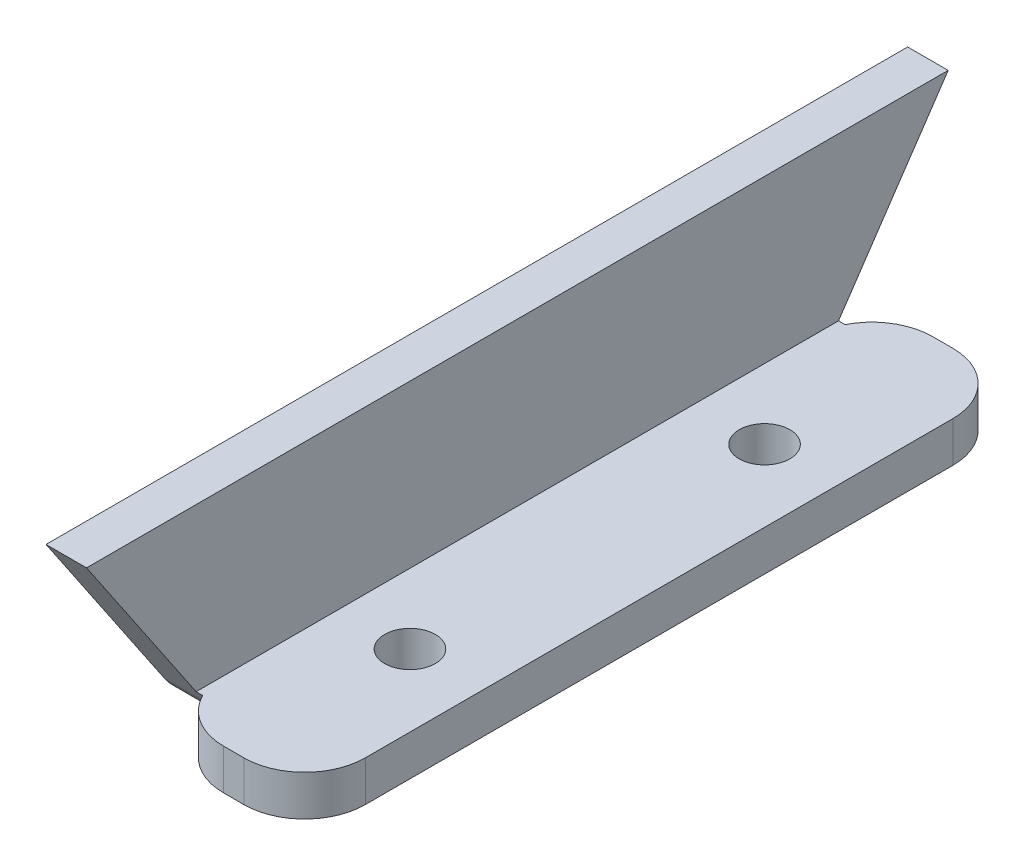
ISO-10303-21;
HEADER;
FILE_DESCRIPTION(('STEP AP214'),'2;1');
FILE_NAME('part.step','',(''),(''),'','','');
FILE_SCHEMA(('AUTOMOTIVE_DESIGN { 1 0 10303 214 1 1 1 1 }'));
ENDSEC;
DATA;
#1=APPLICATION_CONTEXT('core data for automotive mechanical design processes');
#2=APPLICATION_PROTOCOL_DEFINITION('international standard','automotive_design',2000,#1);
#3=PRODUCT_CONTEXT('',#1,'mechanical');
#4=PRODUCT('Part','Part','',(#3));
#5=PRODUCT_RELATED_PRODUCT_CATEGORY('part','',(#4));
#6=PRODUCT_DEFINITION_FORMATION('','',#4);
#7=PRODUCT_DEFINITION_CONTEXT('part definition',#1,'design');
#8=PRODUCT_DEFINITION('design','',#6,#7);
#9=PRODUCT_DEFINITION_SHAPE('','',#8);
#10=(LENGTH_UNIT() NAMED_UNIT(*) SI_UNIT(.MILLI.,.METRE.));
#11=(NAMED_UNIT(*) PLANE_ANGLE_UNIT() SI_UNIT($,.RADIAN.));
#12=(NAMED_UNIT(*) SI_UNIT($,.STERADIAN.) SOLID_ANGLE_UNIT());
#13=UNCERTAINTY_MEASURE_WITH_UNIT(LENGTH_MEASURE(1.E-05),#10,'distance_accuracy_value','');
#14=(GEOMETRIC_REPRESENTATION_CONTEXT(3) GLOBAL_UNCERTAINTY_ASSIGNED_CONTEXT((#13)) GLOBAL_UNIT_ASSIGNED_CONTEXT((#10,
#11,#12)) REPRESENTATION_CONTEXT('',''));
#15=CARTESIAN_POINT('',(0.,0.,0.));
#16=DIRECTION('',(0.,0.,1.));
#17=DIRECTION('',(1.,0.,0.));
#18=AXIS2_PLACEMENT_3D('',#15,#16,#17);
#19=CARTESIAN_POINT('',(0.,-20.7753854246319,0.));
#20=DIRECTION('',(0.,-1.,0.));
#21=DIRECTION('',(0.,0.,-1.));
#22=AXIS2_PLACEMENT_3D('',#19,#20,#21);
#23=PLANE('',#22);
#24=CARTESIAN_POINT('',(3.45011650694153,-20.7753854246319,-8.75));
#25=DIRECTION('',(0.,1.,0.));
#26=DIRECTION('',(0.,0.,1.));
#27=AXIS2_PLACEMENT_3D('',#24,#25,#26);
#28=CIRCLE('',#27,1.25);
#29=CARTESIAN_POINT('',(3.45011650694153,-20.7753854246319,-7.5));
#30=VERTEX_POINT('',#29);
#31=EDGE_CURVE('E380',#30,#30,#28,.T.);
#32=ORIENTED_EDGE('',*,*,#31,.F.);
#33=EDGE_LOOP('',(#32));
#34=FACE_BOUND('',#33,.T.);
#35=DIRECTION('',(0.,0.,-1.));
#36=VECTOR('',#35,1.);
#37=CARTESIAN_POINT('',(0.,-20.7753854246319,14.5));
#38=LINE('',#37,#36);
#39=CARTESIAN_POINT('',(0.,-20.7753854246319,15.8526548687186));
#40=VERTEX_POINT('',#39);
#41=CARTESIAN_POINT('',(0.,-20.7753854246319,-15.8526548687186));
#42=VERTEX_POINT('',#41);
#43=EDGE_CURVE('E197',#40,#42,#38,.T.);
#44=ORIENTED_EDGE('',*,*,#43,.F.);
#45=DIRECTION('',(1.,0.,0.));
#46=VECTOR('',#45,1.);
#47=CARTESIAN_POINT('',(-2.,-20.7753854246319,15.8526548687186));
#48=LINE('',#47,#46);
#49=CARTESIAN_POINT('',(0.322253782351296,-20.7753854246319,15.8526548687186));
#50=VERTEX_POINT('',#49);
#51=EDGE_CURVE('E71',#40,#50,#48,.T.);
#52=ORIENTED_EDGE('',*,*,#51,.T.);
#53=CARTESIAN_POINT('',(3.,-20.7753854246319,14.5));
#54=DIRECTION('',(0.,-1.,0.));
#55=DIRECTION('',(0.,0.,-1.));
#56=AXIS2_PLACEMENT_3D('',#53,#54,#55);
#57=CIRCLE('',#56,3.);
#58=CARTESIAN_POINT('',(3.,-20.7753854246319,17.5));
#59=VERTEX_POINT('',#58);
#60=EDGE_CURVE('E220',#50,#59,#57,.F.);
#61=ORIENTED_EDGE('',*,*,#60,.T.);
#62=DIRECTION('',(-1.,0.,0.));
#63=VECTOR('',#62,1.);
#64=CARTESIAN_POINT('',(-2.,-20.7753854246319,17.5));
#65=LINE('',#64,#63);
#66=CARTESIAN_POINT('',(4.00000000000001,-20.7753854246319,17.5));
#67=VERTEX_POINT('',#66);
#68=EDGE_CURVE('E346',#67,#59,#65,.T.);
#69=ORIENTED_EDGE('',*,*,#68,.F.);
#70=CARTESIAN_POINT('',(4.00000000000001,-20.7753854246319,14.5));
#71=DIRECTION('',(0.,-1.,0.));
#72=DIRECTION('',(0.,0.,-1.));
#73=AXIS2_PLACEMENT_3D('',#70,#71,#72);
#74=CIRCLE('',#73,3.);
#75=CARTESIAN_POINT('',(7.00000000000001,-20.7753854246319,14.5));
#76=VERTEX_POINT('',#75);
#77=EDGE_CURVE('E211',#67,#76,#74,.F.);
#78=ORIENTED_EDGE('',*,*,#77,.T.);
#79=DIRECTION('',(0.,0.,1.));
#80=VECTOR('',#79,1.);
#81=CARTESIAN_POINT('',(7.00000000000001,-20.7753854246319,14.5));
#82=LINE('',#81,#80);
#83=CARTESIAN_POINT('',(7.00000000000001,-20.7753854246319,-14.5));
#84=VERTEX_POINT('',#83);
#85=EDGE_CURVE('E343',#84,#76,#82,.T.);
#86=ORIENTED_EDGE('',*,*,#85,.F.);
#87=CARTESIAN_POINT('',(4.00000000000001,-20.7753854246319,-14.5));
#88=DIRECTION('',(0.,-1.,0.));
#89=DIRECTION('',(0.,0.,-1.));
#90=AXIS2_PLACEMENT_3D('',#87,#88,#89);
#91=CIRCLE('',#90,3.);
#92=CARTESIAN_POINT('',(4.00000000000001,-20.7753854246319,-17.5));
#93=VERTEX_POINT('',#92);
#94=EDGE_CURVE('E213',#84,#93,#91,.F.);
#95=ORIENTED_EDGE('',*,*,#94,.T.);
#96=DIRECTION('',(1.,0.,0.));
#97=VECTOR('',#96,1.);
#98=CARTESIAN_POINT('',(-2.,-20.7753854246319,-17.5));
#99=LINE('',#98,#97);
#100=CARTESIAN_POINT('',(3.,-20.7753854246319,-17.5));
#101=VERTEX_POINT('',#100);
#102=EDGE_CURVE('E318',#101,#93,#99,.T.);
#103=ORIENTED_EDGE('',*,*,#102,.F.);
#104=CARTESIAN_POINT('',(3.,-20.7753854246319,-14.5));
#105=DIRECTION('',(0.,-1.,0.));
#106=DIRECTION('',(0.,0.,-1.));
#107=AXIS2_PLACEMENT_3D('',#104,#105,#106);
#108=CIRCLE('',#107,3.);
#109=CARTESIAN_POINT('',(0.322253782351291,-20.7753854246319,-15.8526548687186));
#110=VERTEX_POINT('',#109);
#111=EDGE_CURVE('E215',#101,#110,#108,.F.);
#112=ORIENTED_EDGE('',*,*,#111,.T.);
#113=DIRECTION('',(-1.,0.,0.));
#114=VECTOR('',#113,1.);
#115=CARTESIAN_POINT('',(-2.,-20.7753854246319,-15.8526548687186));
#116=LINE('',#115,#114);
#117=EDGE_CURVE('E218',#110,#42,#116,.T.);
#118=ORIENTED_EDGE('',*,*,#117,.T.);
#119=EDGE_LOOP('',(#44,#52,#61,#69,#78,#86,#95,#103,#112,#118));
#120=FACE_BOUND('',#119,.T.);
#121=CARTESIAN_POINT('',(3.45011650694153,-20.7753854246319,8.75));
#122=DIRECTION('',(0.,1.,0.));
#123=DIRECTION('',(0.,0.,1.));
#124=AXIS2_PLACEMENT_3D('',#121,#122,#123);
#125=CIRCLE('',#124,1.25);
#126=CARTESIAN_POINT('',(3.45011650694153,-20.7753854246319,10.));
#127=VERTEX_POINT('',#126);
#128=EDGE_CURVE('E386',#127,#127,#125,.T.);
#129=ORIENTED_EDGE('',*,*,#128,.F.);
#130=EDGE_LOOP('',(#129));
#131=FACE_BOUND('',#130,.T.);
#132=ADVANCED_FACE('F43',(#34,#120,#131),#23,.F.);
#133=CARTESIAN_POINT('',(0.,0.,0.));
#134=DIRECTION('',(1.,0.,0.));
#135=DIRECTION('',(0.,0.,-1.));
#136=AXIS2_PLACEMENT_3D('',#133,#134,#135);
#137=PLANE('',#136);
#138=DIRECTION('',(0.,-0.828338441447025,-0.560228012885034));
#139=VECTOR('',#138,1.);
#140=CARTESIAN_POINT('',(0.,-22.7753854246319,14.5));
#141=LINE('',#140,#139);
#142=CARTESIAN_POINT('',(0.,-12.7753854246319,21.2632743435928));
#143=VERTEX_POINT('',#142);
#144=EDGE_CURVE('E313',#143,#40,#141,.T.);
#145=ORIENTED_EDGE('',*,*,#144,.T.);
#146=ORIENTED_EDGE('',*,*,#43,.T.);
#147=DIRECTION('',(0.,0.828338441447025,-0.560228012885034));
#148=VECTOR('',#147,1.);
#149=CARTESIAN_POINT('',(0.,-22.7753854246319,-14.5));
#150=LINE('',#149,#148);
#151=CARTESIAN_POINT('',(0.,-12.7753854246319,-21.2632743435928));
#152=VERTEX_POINT('',#151);
#153=EDGE_CURVE('E314',#42,#152,#150,.T.);
#154=ORIENTED_EDGE('',*,*,#153,.T.);
#155=DIRECTION('',(0.,0.,1.));
#156=VECTOR('',#155,1.);
#157=CARTESIAN_POINT('',(0.,-12.7753854246319,21.2632743435928));
#158=LINE('',#157,#156);
#159=EDGE_CURVE('E306',#152,#143,#158,.T.);
#160=ORIENTED_EDGE('',*,*,#159,.T.);
#161=EDGE_LOOP('',(#145,#146,#154,#160));
#162=FACE_BOUND('',#161,.T.);
#163=ADVANCED_FACE('F263',(#162),#137,.T.);
#164=CARTESIAN_POINT('',(-2.,-22.7753854246319,-14.5));
#165=DIRECTION('',(0.,-0.560228012885034,-0.828338441447025));
#166=DIRECTION('',(0.,0.828338441447025,-0.560228012885034));
#167=AXIS2_PLACEMENT_3D('',#164,#165,#166);
#168=PLANE('',#167);
#169=ORIENTED_EDGE('',*,*,#153,.F.);
#170=ORIENTED_EDGE('',*,*,#117,.F.);
#171=CARTESIAN_POINT('',(3.,-22.7753854246319,-14.5));
#172=DIRECTION('',(0.,-0.560228012885034,-0.828338441447025));
#173=DIRECTION('',(0.,-0.828338441447025,0.560228012885034));
#174=AXIS2_PLACEMENT_3D('',#171,#172,#173);
#175=ELLIPSE('',#174,5.35496249919877,3.);
#176=CARTESIAN_POINT('',(0.135768985090472,-21.456069463287,-15.3922895792456));
#177=VERTEX_POINT('',#176);
#178=EDGE_CURVE('E57',#110,#177,#175,.F.);
#179=ORIENTED_EDGE('',*,*,#178,.T.);
#180=DIRECTION('',(1.,0.,0.));
#181=VECTOR('',#180,1.);
#182=CARTESIAN_POINT('',(-2.,-21.456069463287,-15.3922895792456));
#183=LINE('',#182,#181);
#184=CARTESIAN_POINT('',(-2.,-21.456069463287,-15.3922895792456));
#185=VERTEX_POINT('',#184);
#186=EDGE_CURVE('E63',#177,#185,#183,.F.);
#187=ORIENTED_EDGE('',*,*,#186,.T.);
#188=DIRECTION('',(0.,0.828338441447025,-0.560228012885034));
#189=VECTOR('',#188,1.);
#190=CARTESIAN_POINT('',(-2.,-22.7753854246319,-14.5));
#191=LINE('',#190,#189);
#192=CARTESIAN_POINT('',(-2.,-12.7753854246319,-21.2632743435928));
#193=VERTEX_POINT('',#192);
#194=EDGE_CURVE('E316',#185,#193,#191,.T.);
#195=ORIENTED_EDGE('',*,*,#194,.T.);
#196=DIRECTION('',(1.,0.,0.));
#197=VECTOR('',#196,1.);
#198=CARTESIAN_POINT('',(-2.,-12.7753854246319,-21.2632743435928));
#199=LINE('',#198,#197);
#200=EDGE_CURVE('E309',#193,#152,#199,.T.);
#201=ORIENTED_EDGE('',*,*,#200,.T.);
#202=EDGE_LOOP('',(#169,#170,#179,#187,#195,#201));
#203=FACE_BOUND('',#202,.T.);
#204=ADVANCED_FACE('F252',(#203),#168,.T.);
#205=CARTESIAN_POINT('',(-2.,-22.7753854246319,14.5));
#206=DIRECTION('',(0.,-1.,0.));
#207=DIRECTION('',(0.,0.,-1.));
#208=AXIS2_PLACEMENT_3D('',#205,#206,#207);
#209=PLANE('',#208);
#210=CARTESIAN_POINT('',(3.45011650694153,-22.7753854246319,8.75));
#211=DIRECTION('',(0.,-1.,0.));
#212=DIRECTION('',(0.,0.,-1.));
#213=AXIS2_PLACEMENT_3D('',#210,#211,#212);
#214=CIRCLE('',#213,1.25);
#215=CARTESIAN_POINT('',(3.45011650694153,-22.7753854246319,7.5));
#216=VERTEX_POINT('',#215);
#217=EDGE_CURVE('E383',#216,#216,#214,.T.);
#218=ORIENTED_EDGE('',*,*,#217,.F.);
#219=EDGE_LOOP('',(#218));
#220=FACE_BOUND('',#219,.T.);
#221=CARTESIAN_POINT('',(3.45011650694153,-22.7753854246319,-8.75));
#222=DIRECTION('',(0.,-1.,0.));
#223=DIRECTION('',(0.,0.,-1.));
#224=AXIS2_PLACEMENT_3D('',#221,#222,#223);
#225=CIRCLE('',#224,1.25);
#226=CARTESIAN_POINT('',(3.45011650694153,-22.7753854246319,-10.));
#227=VERTEX_POINT('',#226);
#228=EDGE_CURVE('E372',#227,#227,#225,.T.);
#229=ORIENTED_EDGE('',*,*,#228,.F.);
#230=EDGE_LOOP('',(#229));
#231=FACE_BOUND('',#230,.T.);
#232=DIRECTION('',(-1.,0.,0.));
#233=VECTOR('',#232,1.);
#234=CARTESIAN_POINT('',(-2.,-22.7753854246319,17.5));
#235=LINE('',#234,#233);
#236=CARTESIAN_POINT('',(4.00000000000001,-22.7753854246319,17.5));
#237=VERTEX_POINT('',#236);
#238=CARTESIAN_POINT('',(3.,-22.7753854246319,17.5));
#239=VERTEX_POINT('',#238);
#240=EDGE_CURVE('E368',#237,#239,#235,.T.);
#241=ORIENTED_EDGE('',*,*,#240,.T.);
#242=CARTESIAN_POINT('',(3.,-22.7753854246319,14.5));
#243=DIRECTION('',(0.,-1.,0.));
#244=DIRECTION('',(0.,0.,-1.));
#245=AXIS2_PLACEMENT_3D('',#242,#243,#244);
#246=CIRCLE('',#245,3.);
#247=CARTESIAN_POINT('',(0.,-22.7753854246319,14.5));
#248=VERTEX_POINT('',#247);
#249=EDGE_CURVE('E181',#239,#248,#246,.T.);
#250=ORIENTED_EDGE('',*,*,#249,.T.);
#251=DIRECTION('',(0.,0.,-1.));
#252=VECTOR('',#251,1.);
#253=CARTESIAN_POINT('',(0.,-22.7753854246319,14.5));
#254=LINE('',#253,#252);
#255=CARTESIAN_POINT('',(0.,-22.7753854246319,12.9072742549046));
#256=VERTEX_POINT('',#255);
#257=EDGE_CURVE('E165',#248,#256,#254,.T.);
#258=ORIENTED_EDGE('',*,*,#257,.T.);
#259=DIRECTION('',(1.,0.,0.));
#260=VECTOR('',#259,1.);
#261=CARTESIAN_POINT('',(-2.,-22.7753854246319,12.9072742549046));
#262=LINE('',#261,#260);
#263=CARTESIAN_POINT('',(-2.,-22.7753854246319,12.9072742549046));
#264=VERTEX_POINT('',#263);
#265=EDGE_CURVE('E179',#256,#264,#262,.F.);
#266=ORIENTED_EDGE('',*,*,#265,.T.);
#267=DIRECTION('',(0.,0.,-1.));
#268=VECTOR('',#267,1.);
#269=CARTESIAN_POINT('',(-2.,-22.7753854246319,14.5));
#270=LINE('',#269,#268);
#271=CARTESIAN_POINT('',(-2.,-22.7753854246319,-12.9072742549046));
#272=VERTEX_POINT('',#271);
#273=EDGE_CURVE('E325',#264,#272,#270,.T.);
#274=ORIENTED_EDGE('',*,*,#273,.T.);
#275=DIRECTION('',(1.,0.,0.));
#276=VECTOR('',#275,1.);
#277=CARTESIAN_POINT('',(-2.,-22.7753854246319,-12.9072742549046));
#278=LINE('',#277,#276);
#279=CARTESIAN_POINT('',(0.,-22.7753854246319,-12.9072742549046));
#280=VERTEX_POINT('',#279);
#281=EDGE_CURVE('E172',#272,#280,#278,.T.);
#282=ORIENTED_EDGE('',*,*,#281,.T.);
#283=CARTESIAN_POINT('',(0.,-22.7753854246319,-14.5));
#284=VERTEX_POINT('',#283);
#285=EDGE_CURVE('E183',#280,#284,#254,.T.);
#286=ORIENTED_EDGE('',*,*,#285,.T.);
#287=CARTESIAN_POINT('',(3.,-22.7753854246319,-14.5));
#288=DIRECTION('',(0.,-1.,0.));
#289=DIRECTION('',(0.,0.,-1.));
#290=AXIS2_PLACEMENT_3D('',#287,#288,#289);
#291=CIRCLE('',#290,3.);
#292=CARTESIAN_POINT('',(3.,-22.7753854246319,-17.5));
#293=VERTEX_POINT('',#292);
#294=EDGE_CURVE('E207',#284,#293,#291,.T.);
#295=ORIENTED_EDGE('',*,*,#294,.T.);
#296=DIRECTION('',(1.,0.,0.));
#297=VECTOR('',#296,1.);
#298=CARTESIAN_POINT('',(-2.,-22.7753854246319,-17.5));
#299=LINE('',#298,#297);
#300=CARTESIAN_POINT('',(4.00000000000001,-22.7753854246319,-17.5));
#301=VERTEX_POINT('',#300);
#302=EDGE_CURVE('E182',#293,#301,#299,.T.);
#303=ORIENTED_EDGE('',*,*,#302,.T.);
#304=CARTESIAN_POINT('',(4.00000000000001,-22.7753854246319,-14.5));
#305=DIRECTION('',(0.,-1.,0.));
#306=DIRECTION('',(0.,0.,-1.));
#307=AXIS2_PLACEMENT_3D('',#304,#305,#306);
#308=CIRCLE('',#307,3.);
#309=CARTESIAN_POINT('',(7.00000000000001,-22.7753854246319,-14.5));
#310=VERTEX_POINT('',#309);
#311=EDGE_CURVE('E205',#301,#310,#308,.T.);
#312=ORIENTED_EDGE('',*,*,#311,.T.);
#313=DIRECTION('',(0.,0.,1.));
#314=VECTOR('',#313,1.);
#315=CARTESIAN_POINT('',(7.00000000000001,-22.7753854246319,14.5));
#316=LINE('',#315,#314);
#317=CARTESIAN_POINT('',(7.00000000000001,-22.7753854246319,14.5));
#318=VERTEX_POINT('',#317);
#319=EDGE_CURVE('E371',#310,#318,#316,.T.);
#320=ORIENTED_EDGE('',*,*,#319,.T.);
#321=CARTESIAN_POINT('',(4.00000000000001,-22.7753854246319,14.5));
#322=DIRECTION('',(0.,-1.,0.));
#323=DIRECTION('',(0.,0.,-1.));
#324=AXIS2_PLACEMENT_3D('',#321,#322,#323);
#325=CIRCLE('',#324,3.);
#326=EDGE_CURVE('E203',#318,#237,#325,.T.);
#327=ORIENTED_EDGE('',*,*,#326,.T.);
#328=EDGE_LOOP('',(#241,#250,#258,#266,#274,#282,#286,#295,#303,#312,#320,#327));
#329=FACE_BOUND('',#328,.T.);
#330=ADVANCED_FACE('F177',(#220,#231,#329),#209,.T.);
#331=CARTESIAN_POINT('',(-2.,-22.7753854246319,14.5));
#332=DIRECTION('',(0.,-0.560228012885034,0.828338441447025));
#333=DIRECTION('',(0.,-0.828338441447025,-0.560228012885034));
#334=AXIS2_PLACEMENT_3D('',#331,#332,#333);
#335=PLANE('',#334);
#336=DIRECTION('',(0.,-0.828338441447025,-0.560228012885034));
#337=VECTOR('',#336,1.);
#338=CARTESIAN_POINT('',(-2.,-22.7753854246319,14.5));
#339=LINE('',#338,#337);
#340=CARTESIAN_POINT('',(-2.,-12.7753854246319,21.2632743435928));
#341=VERTEX_POINT('',#340);
#342=CARTESIAN_POINT('',(-2.,-21.456069463287,15.3922895792456));
#343=VERTEX_POINT('',#342);
#344=EDGE_CURVE('E353',#341,#343,#339,.T.);
#345=ORIENTED_EDGE('',*,*,#344,.T.);
#346=DIRECTION('',(1.,0.,0.));
#347=VECTOR('',#346,1.);
#348=CARTESIAN_POINT('',(-2.,-21.456069463287,15.3922895792456));
#349=LINE('',#348,#347);
#350=CARTESIAN_POINT('',(0.135768985090478,-21.456069463287,15.3922895792456));
#351=VERTEX_POINT('',#350);
#352=EDGE_CURVE('E323',#343,#351,#349,.T.);
#353=ORIENTED_EDGE('',*,*,#352,.T.);
#354=CARTESIAN_POINT('',(3.,-22.7753854246319,14.5));
#355=DIRECTION('',(0.,-0.560228012885034,0.828338441447025));
#356=DIRECTION('',(0.,-0.828338441447025,-0.560228012885034));
#357=AXIS2_PLACEMENT_3D('',#354,#355,#356);
#358=ELLIPSE('',#357,5.35496249919877,3.);
#359=EDGE_CURVE('E244',#351,#50,#358,.F.);
#360=ORIENTED_EDGE('',*,*,#359,.T.);
#361=ORIENTED_EDGE('',*,*,#51,.F.);
#362=ORIENTED_EDGE('',*,*,#144,.F.);
#363=DIRECTION('',(1.,0.,0.));
#364=VECTOR('',#363,1.);
#365=CARTESIAN_POINT('',(-2.,-12.7753854246319,21.2632743435928));
#366=LINE('',#365,#364);
#367=EDGE_CURVE('E311',#341,#143,#366,.T.);
#368=ORIENTED_EDGE('',*,*,#367,.F.);
#369=EDGE_LOOP('',(#345,#353,#360,#361,#362,#368));
#370=FACE_BOUND('',#369,.T.);
#371=ADVANCED_FACE('F296',(#370),#335,.T.);
#372=CARTESIAN_POINT('',(-2.,-12.7753854246319,21.2632743435928));
#373=DIRECTION('',(0.,1.,0.));
#374=DIRECTION('',(0.,0.,1.));
#375=AXIS2_PLACEMENT_3D('',#372,#373,#374);
#376=PLANE('',#375);
#377=ORIENTED_EDGE('',*,*,#159,.F.);
#378=ORIENTED_EDGE('',*,*,#200,.F.);
#379=DIRECTION('',(0.,0.,1.));
#380=VECTOR('',#379,1.);
#381=CARTESIAN_POINT('',(-2.,-12.7753854246319,21.2632743435928));
#382=LINE('',#381,#380);
#383=EDGE_CURVE('E351',#193,#341,#382,.T.);
#384=ORIENTED_EDGE('',*,*,#383,.T.);
#385=ORIENTED_EDGE('',*,*,#367,.T.);
#386=EDGE_LOOP('',(#377,#378,#384,#385));
#387=FACE_BOUND('',#386,.T.);
#388=ADVANCED_FACE('F291',(#387),#376,.T.);
#389=CARTESIAN_POINT('',(-2.,0.,0.));
#390=DIRECTION('',(1.,0.,0.));
#391=DIRECTION('',(0.,0.,-1.));
#392=AXIS2_PLACEMENT_3D('',#389,#390,#391);
#393=PLANE('',#392);
#394=ORIENTED_EDGE('',*,*,#273,.F.);
#395=CARTESIAN_POINT('',(-2.,-19.7753854246319,12.9072742549046));
#396=DIRECTION('',(1.,0.,0.));
#397=DIRECTION('',(0.,0.,-1.));
#398=AXIS2_PLACEMENT_3D('',#395,#396,#397);
#399=CIRCLE('',#398,3.);
#400=EDGE_CURVE('E188',#264,#343,#399,.F.);
#401=ORIENTED_EDGE('',*,*,#400,.T.);
#402=ORIENTED_EDGE('',*,*,#344,.F.);
#403=ORIENTED_EDGE('',*,*,#383,.F.);
#404=ORIENTED_EDGE('',*,*,#194,.F.);
#405=CARTESIAN_POINT('',(-2.,-19.7753854246319,-12.9072742549046));
#406=DIRECTION('',(1.,0.,0.));
#407=DIRECTION('',(0.,0.,-1.));
#408=AXIS2_PLACEMENT_3D('',#405,#406,#407);
#409=CIRCLE('',#408,3.);
#410=EDGE_CURVE('E189',#185,#272,#409,.F.);
#411=ORIENTED_EDGE('',*,*,#410,.T.);
#412=EDGE_LOOP('',(#394,#401,#402,#403,#404,#411));
#413=FACE_BOUND('',#412,.T.);
#414=ADVANCED_FACE('F251',(#413),#393,.F.);
#415=CARTESIAN_POINT('',(-2.,-19.7753854246319,12.9072742549046));
#416=DIRECTION('',(1.,0.,0.));
#417=DIRECTION('',(0.,0.,-1.));
#418=AXIS2_PLACEMENT_3D('',#415,#416,#417);
#419=CYLINDRICAL_SURFACE('',#418,3.);
#420=ORIENTED_EDGE('',*,*,#400,.F.);
#421=ORIENTED_EDGE('',*,*,#265,.F.);
#422=CARTESIAN_POINT('',(0.,-19.7753854246319,12.9072742549046));
#423=DIRECTION('',(1.,0.,0.));
#424=DIRECTION('',(0.,0.,-1.));
#425=AXIS2_PLACEMENT_3D('',#422,#423,#424);
#426=CIRCLE('',#425,3.);
#427=CARTESIAN_POINT('',(0.,-22.317672721715,14.5));
#428=VERTEX_POINT('',#427);
#429=EDGE_CURVE('E162',#428,#256,#426,.T.);
#430=ORIENTED_EDGE('',*,*,#429,.F.);
#431=CARTESIAN_POINT('',(0.,-22.317672721715,14.5));
#432=CARTESIAN_POINT('',(-7.08104430156292E-06,-22.2755740345063,14.5672239704958));
#433=CARTESIAN_POINT('',(0.0022586894497279,-22.2308090677565,14.6327271705983));
#434=CARTESIAN_POINT('',(0.0105949557986268,-22.1363982120105,14.7598012363672));
#435=CARTESIAN_POINT('',(0.016662966807015,-22.0867555285594,14.8213746413054));
#436=CARTESIAN_POINT('',(0.031730749439193,-21.983898887987,14.9391406887567));
#437=CARTESIAN_POINT('',(0.0406769880491282,-21.9307632546004,14.9954090152668));
#438=CARTESIAN_POINT('',(0.0608094277035964,-21.8205435999963,15.1034710957977));
#439=CARTESIAN_POINT('',(0.0719950587205409,-21.763460585983,15.15526598372));
#440=CARTESIAN_POINT('',(0.0920022281969851,-21.6648687076702,15.238055924608));
#441=CARTESIAN_POINT('',(0.100407492490279,-21.6243413403752,15.2703318928623));
#442=CARTESIAN_POINT('',(0.117751358456795,-21.5414854784503,15.3328876666724));
#443=CARTESIAN_POINT('',(0.126692890883889,-21.4991475348347,15.3631541492192));
#444=CARTESIAN_POINT('',(0.135768985090482,-21.456069463287,15.3922895792456));
#445=B_SPLINE_CURVE_WITH_KNOTS('',3,(#431,#432,#433,#434,#435,#436,#437,#438,#439,#440,#441,
#442,#443,#444),.UNSPECIFIED.,.F.,.F.,(4,2,2,2,2,2,4),(0.,0.237797718958352,0.475440193809974,
0.708896051137234,0.942292558675454,1.09968690955865,1.25803777089069),.UNSPECIFIED.);
#446=EDGE_CURVE('E236',#428,#351,#445,.T.);
#447=ORIENTED_EDGE('',*,*,#446,.T.);
#448=ORIENTED_EDGE('',*,*,#352,.F.);
#449=EDGE_LOOP('',(#420,#421,#430,#447,#448));
#450=FACE_BOUND('',#449,.T.);
#451=ADVANCED_FACE('F186',(#450),#419,.T.);
#452=CARTESIAN_POINT('',(-2.,-19.7753854246319,-12.9072742549046));
#453=DIRECTION('',(1.,0.,0.));
#454=DIRECTION('',(0.,0.,-1.));
#455=AXIS2_PLACEMENT_3D('',#452,#453,#454);
#456=CYLINDRICAL_SURFACE('',#455,3.);
#457=ORIENTED_EDGE('',*,*,#410,.F.);
#458=ORIENTED_EDGE('',*,*,#186,.F.);
#459=CARTESIAN_POINT('',(0.135768985090473,-21.456069463287,-15.3922895792456));
#460=CARTESIAN_POINT('',(0.122143328281563,-21.5207428748665,-15.348551816383));
#461=CARTESIAN_POINT('',(0.108817102979331,-21.5837640921651,-15.3022467288242));
#462=CARTESIAN_POINT('',(0.0834920177461205,-21.7062450110514,-15.2046463210875));
#463=CARTESIAN_POINT('',(0.0714950425020444,-21.7656996022944,-15.1533441044301));
#464=CARTESIAN_POINT('',(0.0498128123967785,-21.8794866192582,-15.0470640810663));
#465=CARTESIAN_POINT('',(0.0400870364886483,-21.933896326211,-14.9921774694238));
#466=CARTESIAN_POINT('',(0.0233748865629506,-22.0384629008969,-14.8781762904895));
#467=CARTESIAN_POINT('',(0.0163860076218655,-22.0886236243642,-14.8190656480888));
#468=CARTESIAN_POINT('',(0.00756083042753796,-22.1687591925456,-14.7168322261915));
#469=CARTESIAN_POINT('',(0.00478782854045067,-22.1999897494339,-14.6747686359415));
#470=CARTESIAN_POINT('',(0.00100086136137091,-22.2604401190344,-14.5887287695627));
#471=CARTESIAN_POINT('',(-1.3523244208758E-06,-22.2896452718583,-14.5447416859972));
#472=CARTESIAN_POINT('',(0.,-22.317672721715,-14.5));
#473=B_SPLINE_CURVE_WITH_KNOTS('',3,(#459,#460,#461,#462,#463,#464,#465,#466,#467,#468,#469,
#470,#471,#472),.UNSPECIFIED.,.F.,.F.,(4,2,2,2,2,2,4),(0.,0.237732612934411,0.475798096119726,
0.709220740817091,0.942429245153417,1.0997237026962,1.25805815831172),.UNSPECIFIED.);
#474=CARTESIAN_POINT('',(0.,-22.317672721715,-14.5));
#475=VERTEX_POINT('',#474);
#476=EDGE_CURVE('E11',#177,#475,#473,.T.);
#477=ORIENTED_EDGE('',*,*,#476,.T.);
#478=CARTESIAN_POINT('',(0.,-19.7753854246319,-12.9072742549046));
#479=DIRECTION('',(1.,0.,0.));
#480=DIRECTION('',(0.,0.,-1.));
#481=AXIS2_PLACEMENT_3D('',#478,#479,#480);
#482=CIRCLE('',#481,3.);
#483=EDGE_CURVE('E173',#280,#475,#482,.T.);
#484=ORIENTED_EDGE('',*,*,#483,.F.);
#485=ORIENTED_EDGE('',*,*,#281,.F.);
#486=EDGE_LOOP('',(#457,#458,#477,#484,#485));
#487=FACE_BOUND('',#486,.T.);
#488=ADVANCED_FACE('F250',(#487),#456,.T.);
#489=CARTESIAN_POINT('',(0.,-20.7753854246319,14.5));
#490=DIRECTION('',(-1.,0.,0.));
#491=DIRECTION('',(0.,0.,1.));
#492=AXIS2_PLACEMENT_3D('',#489,#490,#491);
#493=PLANE('',#492);
#494=ORIENTED_EDGE('',*,*,#257,.F.);
#495=DIRECTION('',(0.,-1.,0.));
#496=VECTOR('',#495,1.);
#497=CARTESIAN_POINT('',(0.,-20.7753854246319,14.5));
#498=LINE('',#497,#496);
#499=EDGE_CURVE('E167',#248,#428,#498,.F.);
#500=ORIENTED_EDGE('',*,*,#499,.T.);
#501=ORIENTED_EDGE('',*,*,#429,.T.);
#502=EDGE_LOOP('',(#494,#500,#501));
#503=FACE_BOUND('',#502,.T.);
#504=ADVANCED_FACE('F164',(#503),#493,.T.);
#505=CARTESIAN_POINT('',(7.00000000000001,-20.7753854246319,14.5));
#506=DIRECTION('',(1.,0.,0.));
#507=DIRECTION('',(0.,0.,-1.));
#508=AXIS2_PLACEMENT_3D('',#505,#506,#507);
#509=PLANE('',#508);
#510=ORIENTED_EDGE('',*,*,#319,.F.);
#511=DIRECTION('',(0.,-1.,0.));
#512=VECTOR('',#511,1.);
#513=CARTESIAN_POINT('',(7.00000000000001,-20.7753854246319,-14.5));
#514=LINE('',#513,#512);
#515=EDGE_CURVE('E234',#310,#84,#514,.F.);
#516=ORIENTED_EDGE('',*,*,#515,.T.);
#517=ORIENTED_EDGE('',*,*,#85,.T.);
#518=DIRECTION('',(0.,-1.,0.));
#519=VECTOR('',#518,1.);
#520=CARTESIAN_POINT('',(7.00000000000001,-20.7753854246319,14.5));
#521=LINE('',#520,#519);
#522=EDGE_CURVE('E231',#76,#318,#521,.T.);
#523=ORIENTED_EDGE('',*,*,#522,.T.);
#524=EDGE_LOOP('',(#510,#516,#517,#523));
#525=FACE_BOUND('',#524,.T.);
#526=ADVANCED_FACE('F259',(#525),#509,.T.);
#527=CARTESIAN_POINT('',(-2.,-20.7753854246319,-17.5));
#528=DIRECTION('',(0.,0.,-1.));
#529=DIRECTION('',(-1.,0.,0.));
#530=AXIS2_PLACEMENT_3D('',#527,#528,#529);
#531=PLANE('',#530);
#532=ORIENTED_EDGE('',*,*,#302,.F.);
#533=DIRECTION('',(0.,-1.,0.));
#534=VECTOR('',#533,1.);
#535=CARTESIAN_POINT('',(3.,-20.7753854246319,-17.5));
#536=LINE('',#535,#534);
#537=EDGE_CURVE('E229',#293,#101,#536,.F.);
#538=ORIENTED_EDGE('',*,*,#537,.T.);
#539=ORIENTED_EDGE('',*,*,#102,.T.);
#540=DIRECTION('',(0.,-1.,0.));
#541=VECTOR('',#540,1.);
#542=CARTESIAN_POINT('',(4.00000000000001,-20.7753854246319,-17.5));
#543=LINE('',#542,#541);
#544=EDGE_CURVE('E226',#93,#301,#543,.T.);
#545=ORIENTED_EDGE('',*,*,#544,.T.);
#546=EDGE_LOOP('',(#532,#538,#539,#545));
#547=FACE_BOUND('',#546,.T.);
#548=ADVANCED_FACE('F277',(#547),#531,.T.);
#549=ORIENTED_EDGE('',*,*,#483,.T.);
#550=DIRECTION('',(0.,-1.,0.));
#551=VECTOR('',#550,1.);
#552=CARTESIAN_POINT('',(0.,-20.7753854246319,-14.5));
#553=LINE('',#552,#551);
#554=EDGE_CURVE('E223',#475,#284,#553,.T.);
#555=ORIENTED_EDGE('',*,*,#554,.T.);
#556=ORIENTED_EDGE('',*,*,#285,.F.);
#557=EDGE_LOOP('',(#549,#555,#556));
#558=FACE_BOUND('',#557,.T.);
#559=ADVANCED_FACE('F261',(#558),#493,.T.);
#560=CARTESIAN_POINT('',(-2.,-20.7753854246319,17.5));
#561=DIRECTION('',(0.,0.,1.));
#562=DIRECTION('',(1.,0.,0.));
#563=AXIS2_PLACEMENT_3D('',#560,#561,#562);
#564=PLANE('',#563);
#565=ORIENTED_EDGE('',*,*,#68,.T.);
#566=DIRECTION('',(0.,-1.,0.));
#567=VECTOR('',#566,1.);
#568=CARTESIAN_POINT('',(3.,-20.7753854246319,17.5));
#569=LINE('',#568,#567);
#570=EDGE_CURVE('E200',#59,#239,#569,.T.);
#571=ORIENTED_EDGE('',*,*,#570,.T.);
#572=ORIENTED_EDGE('',*,*,#240,.F.);
#573=DIRECTION('',(0.,-1.,0.));
#574=VECTOR('',#573,1.);
#575=CARTESIAN_POINT('',(4.00000000000001,-20.7753854246319,17.5));
#576=LINE('',#575,#574);
#577=EDGE_CURVE('E198',#237,#67,#576,.F.);
#578=ORIENTED_EDGE('',*,*,#577,.T.);
#579=EDGE_LOOP('',(#565,#571,#572,#578));
#580=FACE_BOUND('',#579,.T.);
#581=ADVANCED_FACE('F282',(#580),#564,.T.);
#582=CARTESIAN_POINT('',(3.,-20.7753854246319,14.5));
#583=DIRECTION('',(0.,-1.,0.));
#584=DIRECTION('',(0.,0.,-1.));
#585=AXIS2_PLACEMENT_3D('',#582,#583,#584);
#586=CYLINDRICAL_SURFACE('',#585,3.);
#587=ORIENTED_EDGE('',*,*,#446,.F.);
#588=ORIENTED_EDGE('',*,*,#499,.F.);
#589=ORIENTED_EDGE('',*,*,#249,.F.);
#590=ORIENTED_EDGE('',*,*,#570,.F.);
#591=ORIENTED_EDGE('',*,*,#60,.F.);
#592=ORIENTED_EDGE('',*,*,#359,.F.);
#593=EDGE_LOOP('',(#587,#588,#589,#590,#591,#592));
#594=FACE_BOUND('',#593,.T.);
#595=ADVANCED_FACE('F245',(#594),#586,.T.);
#596=CARTESIAN_POINT('',(3.,-20.7753854246319,-14.5));
#597=DIRECTION('',(0.,-1.,0.));
#598=DIRECTION('',(0.,0.,-1.));
#599=AXIS2_PLACEMENT_3D('',#596,#597,#598);
#600=CYLINDRICAL_SURFACE('',#599,3.);
#601=ORIENTED_EDGE('',*,*,#111,.F.);
#602=ORIENTED_EDGE('',*,*,#537,.F.);
#603=ORIENTED_EDGE('',*,*,#294,.F.);
#604=ORIENTED_EDGE('',*,*,#554,.F.);
#605=ORIENTED_EDGE('',*,*,#476,.F.);
#606=ORIENTED_EDGE('',*,*,#178,.F.);
#607=EDGE_LOOP('',(#601,#602,#603,#604,#605,#606));
#608=FACE_BOUND('',#607,.T.);
#609=ADVANCED_FACE('F335',(#608),#600,.T.);
#610=CARTESIAN_POINT('',(4.00000000000001,-20.7753854246319,-14.5));
#611=DIRECTION('',(0.,-1.,0.));
#612=DIRECTION('',(0.,0.,-1.));
#613=AXIS2_PLACEMENT_3D('',#610,#611,#612);
#614=CYLINDRICAL_SURFACE('',#613,3.);
#615=ORIENTED_EDGE('',*,*,#94,.F.);
#616=ORIENTED_EDGE('',*,*,#515,.F.);
#617=ORIENTED_EDGE('',*,*,#311,.F.);
#618=ORIENTED_EDGE('',*,*,#544,.F.);
#619=EDGE_LOOP('',(#615,#616,#617,#618));
#620=FACE_BOUND('',#619,.T.);
#621=ADVANCED_FACE('F404',(#620),#614,.T.);
#622=CARTESIAN_POINT('',(4.00000000000001,-20.7753854246319,14.5));
#623=DIRECTION('',(0.,-1.,0.));
#624=DIRECTION('',(0.,0.,-1.));
#625=AXIS2_PLACEMENT_3D('',#622,#623,#624);
#626=CYLINDRICAL_SURFACE('',#625,3.);
#627=ORIENTED_EDGE('',*,*,#77,.F.);
#628=ORIENTED_EDGE('',*,*,#577,.F.);
#629=ORIENTED_EDGE('',*,*,#326,.F.);
#630=ORIENTED_EDGE('',*,*,#522,.F.);
#631=EDGE_LOOP('',(#627,#628,#629,#630));
#632=FACE_BOUND('',#631,.T.);
#633=ADVANCED_FACE('F45',(#632),#626,.T.);
#634=CARTESIAN_POINT('',(3.45011650694153,-20.7753854246319,-8.75));
#635=DIRECTION('',(0.,1.,0.));
#636=DIRECTION('',(0.,0.,1.));
#637=AXIS2_PLACEMENT_3D('',#634,#635,#636);
#638=CYLINDRICAL_SURFACE('',#637,1.25);
#639=ORIENTED_EDGE('',*,*,#228,.T.);
#640=EDGE_LOOP('',(#639));
#641=FACE_BOUND('',#640,.T.);
#642=ORIENTED_EDGE('',*,*,#31,.T.);
#643=EDGE_LOOP('',(#642));
#644=FACE_BOUND('',#643,.T.);
#645=ADVANCED_FACE('F275',(#641,#644),#638,.F.);
#646=CARTESIAN_POINT('',(3.45011650694153,-20.7753854246319,8.75));
#647=DIRECTION('',(0.,1.,0.));
#648=DIRECTION('',(0.,0.,1.));
#649=AXIS2_PLACEMENT_3D('',#646,#647,#648);
#650=CYLINDRICAL_SURFACE('',#649,1.25);
#651=ORIENTED_EDGE('',*,*,#217,.T.);
#652=EDGE_LOOP('',(#651));
#653=FACE_BOUND('',#652,.T.);
#654=ORIENTED_EDGE('',*,*,#128,.T.);
#655=EDGE_LOOP('',(#654));
#656=FACE_BOUND('',#655,.T.);
#657=ADVANCED_FACE('F390',(#653,#656),#650,.F.);
#658=CLOSED_SHELL('',(#132,#163,#204,#330,#371,#388,#414,#451,#488,#504,#526,#548,#559,#581,
#595,#609,#621,#633,#645,#657));
#659=MANIFOLD_SOLID_BREP('B2',#658);
#660=ADVANCED_BREP_SHAPE_REPRESENTATION('',(#18,#659),#14);
#661=SHAPE_DEFINITION_REPRESENTATION(#9,#660);
ENDSEC;
END-ISO-10303-21;
